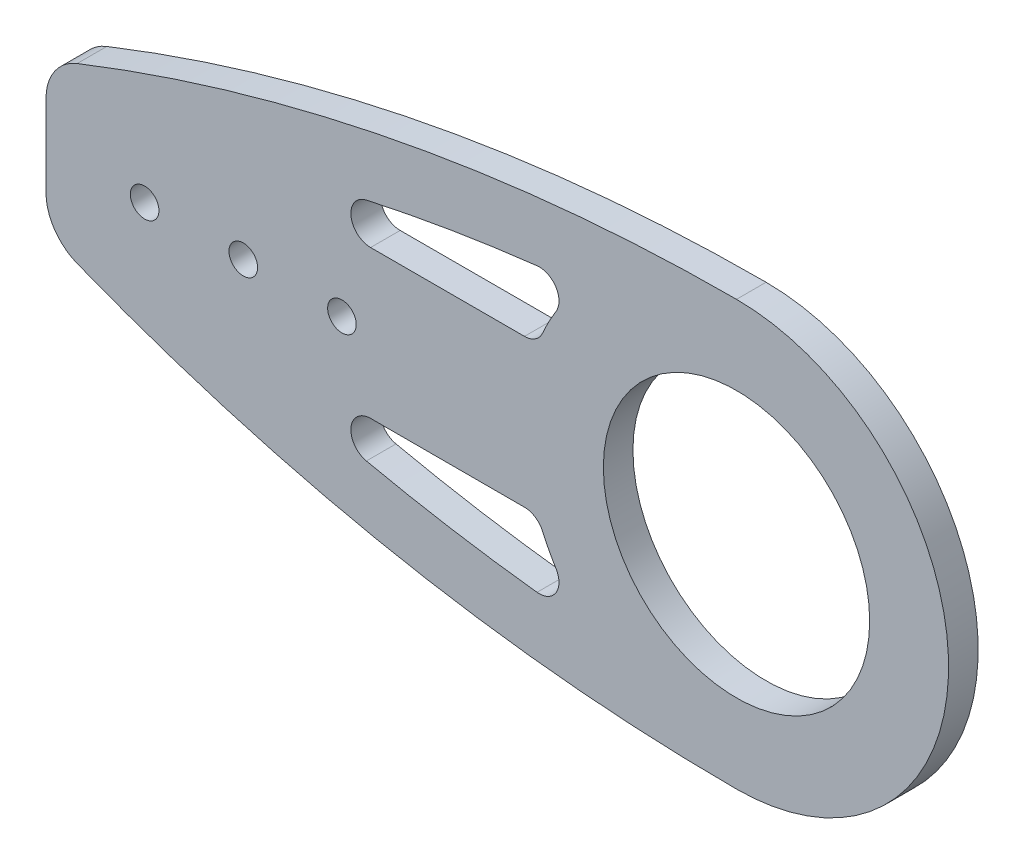
ISO-10303-21;
HEADER;
FILE_DESCRIPTION(('STEP AP214'),'2;1');
FILE_NAME('part.step','',(''),(''),'','','');
FILE_SCHEMA(('AUTOMOTIVE_DESIGN { 1 0 10303 214 1 1 1 1 }'));
ENDSEC;
DATA;
#1=APPLICATION_CONTEXT('core data for automotive mechanical design processes');
#2=APPLICATION_PROTOCOL_DEFINITION('international standard','automotive_design',2000,#1);
#3=PRODUCT_CONTEXT('',#1,'mechanical');
#4=PRODUCT('Part','Part','',(#3));
#5=PRODUCT_RELATED_PRODUCT_CATEGORY('part','',(#4));
#6=PRODUCT_DEFINITION_FORMATION('','',#4);
#7=PRODUCT_DEFINITION_CONTEXT('part definition',#1,'design');
#8=PRODUCT_DEFINITION('design','',#6,#7);
#9=PRODUCT_DEFINITION_SHAPE('','',#8);
#10=(LENGTH_UNIT() NAMED_UNIT(*) SI_UNIT(.MILLI.,.METRE.));
#11=(NAMED_UNIT(*) PLANE_ANGLE_UNIT() SI_UNIT($,.RADIAN.));
#12=(NAMED_UNIT(*) SI_UNIT($,.STERADIAN.) SOLID_ANGLE_UNIT());
#13=UNCERTAINTY_MEASURE_WITH_UNIT(LENGTH_MEASURE(1.E-05),#10,'distance_accuracy_value','');
#14=(GEOMETRIC_REPRESENTATION_CONTEXT(3) GLOBAL_UNCERTAINTY_ASSIGNED_CONTEXT((#13)) GLOBAL_UNIT_ASSIGNED_CONTEXT((#10,
#11,#12)) REPRESENTATION_CONTEXT('',''));
#15=CARTESIAN_POINT('',(0.,0.,0.));
#16=DIRECTION('',(0.,0.,1.));
#17=DIRECTION('',(1.,0.,0.));
#18=AXIS2_PLACEMENT_3D('',#15,#16,#17);
#19=CARTESIAN_POINT('',(20.1494416796099,153.,3.));
#20=DIRECTION('',(0.,0.,1.));
#21=DIRECTION('',(1.,0.,0.));
#22=AXIS2_PLACEMENT_3D('',#19,#20,#21);
#23=PLANE('',#22);
#24=CARTESIAN_POINT('',(20.1494416796099,-7.5,3.));
#25=DIRECTION('',(0.,0.,-1.));
#26=DIRECTION('',(-1.,0.,0.));
#27=AXIS2_PLACEMENT_3D('',#24,#25,#26);
#28=CIRCLE('',#27,21.5);
#29=CARTESIAN_POINT('',(1.85630686055499,-18.796513554716,3.));
#30=VERTEX_POINT('',#29);
#31=CARTESIAN_POINT('',(0.484548781975798,-16.1914893617021,3.));
#32=VERTEX_POINT('',#31);
#33=EDGE_CURVE('E287',#30,#32,#28,.T.);
#34=ORIENTED_EDGE('',*,*,#33,.F.);
#35=CARTESIAN_POINT('',(0.154619900642906,-19.8473520249221,3.));
#36=DIRECTION('',(0.,0.,1.));
#37=DIRECTION('',(1.,0.,0.));
#38=AXIS2_PLACEMENT_3D('',#35,#36,#37);
#39=CIRCLE('',#38,2.);
#40=CARTESIAN_POINT('',(-0.0752056370463723,-21.8341031976224,3.));
#41=VERTEX_POINT('',#40);
#42=EDGE_CURVE('E335',#30,#41,#39,.F.);
#43=ORIENTED_EDGE('',*,*,#42,.T.);
#44=CARTESIAN_POINT('',(20.1494416796099,153.,3.));
#45=DIRECTION('',(0.,0.,1.));
#46=DIRECTION('',(1.,0.,0.));
#47=AXIS2_PLACEMENT_3D('',#44,#45,#46);
#48=CIRCLE('',#47,176.);
#49=CARTESIAN_POINT('',(-17.3714055665337,-18.9540229885058,3.));
#50=VERTEX_POINT('',#49);
#51=EDGE_CURVE('E299',#50,#41,#48,.T.);
#52=ORIENTED_EDGE('',*,*,#51,.F.);
#53=CARTESIAN_POINT('',(-16.9450323023729,-17.,3.));
#54=DIRECTION('',(0.,0.,1.));
#55=DIRECTION('',(1.,0.,0.));
#56=AXIS2_PLACEMENT_3D('',#53,#54,#55);
#57=CIRCLE('',#56,2.);
#58=CARTESIAN_POINT('',(-16.9450323023729,-15.,3.));
#59=VERTEX_POINT('',#58);
#60=EDGE_CURVE('E370',#50,#59,#57,.F.);
#61=ORIENTED_EDGE('',*,*,#60,.T.);
#62=DIRECTION('',(-1.,0.,0.));
#63=VECTOR('',#62,1.);
#64=CARTESIAN_POINT('',(-32.3100665148061,-15.,3.));
#65=LINE('',#64,#63);
#66=CARTESIAN_POINT('',(-1.34474358059481,-15.,3.));
#67=VERTEX_POINT('',#66);
#68=EDGE_CURVE('E294',#67,#59,#65,.T.);
#69=ORIENTED_EDGE('',*,*,#68,.F.);
#70=CARTESIAN_POINT('',(-1.34474358059481,-17.,3.));
#71=DIRECTION('',(0.,0.,1.));
#72=DIRECTION('',(1.,0.,0.));
#73=AXIS2_PLACEMENT_3D('',#70,#71,#72);
#74=CIRCLE('',#73,2.);
#75=EDGE_CURVE('E373',#67,#32,#74,.F.);
#76=ORIENTED_EDGE('',*,*,#75,.T.);
#77=EDGE_LOOP('',(#34,#43,#52,#61,#69,#76));
#78=FACE_BOUND('',#77,.T.);
#79=CARTESIAN_POINT('',(20.1494416796099,-7.5,3.));
#80=DIRECTION('',(0.,0.,-1.));
#81=DIRECTION('',(1.,0.,0.));
#82=AXIS2_PLACEMENT_3D('',#79,#80,#81);
#83=CIRCLE('',#82,21.5);
#84=CARTESIAN_POINT('',(0.484548781975798,1.19148936170213,3.));
#85=VERTEX_POINT('',#84);
#86=CARTESIAN_POINT('',(1.85630686055497,3.79651355471597,3.));
#87=VERTEX_POINT('',#86);
#88=EDGE_CURVE('E279',#85,#87,#83,.T.);
#89=ORIENTED_EDGE('',*,*,#88,.F.);
#90=CARTESIAN_POINT('',(-1.34474358059481,2.00000000000001,3.));
#91=DIRECTION('',(0.,0.,1.));
#92=DIRECTION('',(1.,0.,0.));
#93=AXIS2_PLACEMENT_3D('',#90,#91,#92);
#94=CIRCLE('',#93,2.);
#95=CARTESIAN_POINT('',(-1.34474358059481,0.,3.));
#96=VERTEX_POINT('',#95);
#97=EDGE_CURVE('E361',#85,#96,#94,.F.);
#98=ORIENTED_EDGE('',*,*,#97,.T.);
#99=DIRECTION('',(1.,0.,0.));
#100=VECTOR('',#99,1.);
#101=CARTESIAN_POINT('',(-32.3100665148061,0.,3.));
#102=LINE('',#101,#100);
#103=CARTESIAN_POINT('',(-16.9450323023729,0.,3.));
#104=VERTEX_POINT('',#103);
#105=EDGE_CURVE('E280',#104,#96,#102,.T.);
#106=ORIENTED_EDGE('',*,*,#105,.F.);
#107=CARTESIAN_POINT('',(-16.9450323023729,2.00000000000002,3.));
#108=DIRECTION('',(0.,0.,1.));
#109=DIRECTION('',(1.,0.,0.));
#110=AXIS2_PLACEMENT_3D('',#107,#108,#109);
#111=CIRCLE('',#110,2.);
#112=CARTESIAN_POINT('',(-17.3714055665336,3.95402298850578,3.));
#113=VERTEX_POINT('',#112);
#114=EDGE_CURVE('E54',#104,#113,#111,.F.);
#115=ORIENTED_EDGE('',*,*,#114,.T.);
#116=CARTESIAN_POINT('',(20.1494416796099,-168.,3.));
#117=DIRECTION('',(0.,0.,1.));
#118=DIRECTION('',(1.,0.,0.));
#119=AXIS2_PLACEMENT_3D('',#116,#117,#118);
#120=CIRCLE('',#119,176.);
#121=CARTESIAN_POINT('',(-0.0752056370464174,6.83410319762237,3.));
#122=VERTEX_POINT('',#121);
#123=EDGE_CURVE('E275',#122,#113,#120,.T.);
#124=ORIENTED_EDGE('',*,*,#123,.F.);
#125=CARTESIAN_POINT('',(0.154619900642857,4.84735202492212,3.));
#126=DIRECTION('',(0.,0.,1.));
#127=DIRECTION('',(1.,0.,0.));
#128=AXIS2_PLACEMENT_3D('',#125,#126,#127);
#129=CIRCLE('',#128,2.);
#130=EDGE_CURVE('E334',#122,#87,#129,.F.);
#131=ORIENTED_EDGE('',*,*,#130,.T.);
#132=EDGE_LOOP('',(#89,#98,#106,#115,#124,#131));
#133=FACE_BOUND('',#132,.T.);
#134=CARTESIAN_POINT('',(-39.8505583203901,-7.5,3.));
#135=DIRECTION('',(0.,0.,1.));
#136=DIRECTION('',(1.,0.,0.));
#137=AXIS2_PLACEMENT_3D('',#134,#135,#136);
#138=CIRCLE('',#137,1.45);
#139=CARTESIAN_POINT('',(-38.4005583203901,-7.5,3.));
#140=VERTEX_POINT('',#139);
#141=EDGE_CURVE('E266',#140,#140,#138,.T.);
#142=ORIENTED_EDGE('',*,*,#141,.F.);
#143=EDGE_LOOP('',(#142));
#144=FACE_BOUND('',#143,.T.);
#145=CARTESIAN_POINT('',(-29.8505583203901,-7.5,3.));
#146=DIRECTION('',(0.,0.,1.));
#147=DIRECTION('',(1.,0.,0.));
#148=AXIS2_PLACEMENT_3D('',#145,#146,#147);
#149=CIRCLE('',#148,1.45);
#150=CARTESIAN_POINT('',(-28.4005583203901,-7.5,3.));
#151=VERTEX_POINT('',#150);
#152=EDGE_CURVE('E261',#151,#151,#149,.T.);
#153=ORIENTED_EDGE('',*,*,#152,.F.);
#154=EDGE_LOOP('',(#153));
#155=FACE_BOUND('',#154,.T.);
#156=CARTESIAN_POINT('',(-19.8505583203901,-7.5,3.));
#157=DIRECTION('',(0.,0.,1.));
#158=DIRECTION('',(1.,0.,0.));
#159=AXIS2_PLACEMENT_3D('',#156,#157,#158);
#160=CIRCLE('',#159,1.45);
#161=CARTESIAN_POINT('',(-18.4005583203901,-7.5,3.));
#162=VERTEX_POINT('',#161);
#163=EDGE_CURVE('E252',#162,#162,#160,.T.);
#164=ORIENTED_EDGE('',*,*,#163,.F.);
#165=EDGE_LOOP('',(#164));
#166=FACE_BOUND('',#165,.T.);
#167=DIRECTION('',(0.,-1.,0.));
#168=VECTOR('',#167,1.);
#169=CARTESIAN_POINT('',(-49.8505583203901,0.,3.));
#170=LINE('',#169,#168);
#171=CARTESIAN_POINT('',(-49.8505583203901,-3.36707498194658,3.));
#172=VERTEX_POINT('',#171);
#173=CARTESIAN_POINT('',(-49.8505583203901,-11.6329250180534,3.));
#174=VERTEX_POINT('',#173);
#175=EDGE_CURVE('E205',#172,#174,#170,.T.);
#176=ORIENTED_EDGE('',*,*,#175,.T.);
#177=CARTESIAN_POINT('',(-44.8505583203901,-11.6329250180534,3.));
#178=DIRECTION('',(0.,0.,1.));
#179=DIRECTION('',(1.,0.,0.));
#180=AXIS2_PLACEMENT_3D('',#177,#178,#179);
#181=CIRCLE('',#180,5.);
#182=CARTESIAN_POINT('',(-46.6867165124805,-16.2835726174335,3.));
#183=VERTEX_POINT('',#182);
#184=EDGE_CURVE('E179',#174,#183,#181,.T.);
#185=ORIENTED_EDGE('',*,*,#184,.T.);
#186=CARTESIAN_POINT('',(20.1494416796099,153.,3.));
#187=DIRECTION('',(0.,0.,1.));
#188=DIRECTION('',(1.,0.,0.));
#189=AXIS2_PLACEMENT_3D('',#186,#187,#188);
#190=CIRCLE('',#189,182.);
#191=CARTESIAN_POINT('',(20.1494416796099,-29.,3.));
#192=VERTEX_POINT('',#191);
#193=EDGE_CURVE('E171',#183,#192,#190,.T.);
#194=ORIENTED_EDGE('',*,*,#193,.T.);
#195=CARTESIAN_POINT('',(20.1494416796099,-7.5,3.));
#196=DIRECTION('',(0.,0.,1.));
#197=DIRECTION('',(-1.,0.,0.));
#198=AXIS2_PLACEMENT_3D('',#195,#196,#197);
#199=CIRCLE('',#198,21.5);
#200=CARTESIAN_POINT('',(20.1494416796099,14.,3.));
#201=VERTEX_POINT('',#200);
#202=EDGE_CURVE('E176',#192,#201,#199,.T.);
#203=ORIENTED_EDGE('',*,*,#202,.T.);
#204=CARTESIAN_POINT('',(20.1494416796099,-168.,3.));
#205=DIRECTION('',(0.,0.,1.));
#206=DIRECTION('',(-1.,0.,0.));
#207=AXIS2_PLACEMENT_3D('',#204,#205,#206);
#208=CIRCLE('',#207,182.);
#209=CARTESIAN_POINT('',(-46.6867165124805,1.28357261743348,3.));
#210=VERTEX_POINT('',#209);
#211=EDGE_CURVE('E195',#201,#210,#208,.T.);
#212=ORIENTED_EDGE('',*,*,#211,.T.);
#213=CARTESIAN_POINT('',(-44.8505583203901,-3.36707498194658,3.));
#214=DIRECTION('',(0.,0.,1.));
#215=DIRECTION('',(1.,0.,0.));
#216=AXIS2_PLACEMENT_3D('',#213,#214,#215);
#217=CIRCLE('',#216,5.);
#218=EDGE_CURVE('E217',#210,#172,#217,.T.);
#219=ORIENTED_EDGE('',*,*,#218,.T.);
#220=EDGE_LOOP('',(#176,#185,#194,#203,#212,#219));
#221=FACE_BOUND('',#220,.T.);
#222=CARTESIAN_POINT('',(20.1494416796099,-7.5,3.));
#223=DIRECTION('',(0.,0.,1.));
#224=DIRECTION('',(1.,0.,0.));
#225=AXIS2_PLACEMENT_3D('',#222,#223,#224);
#226=CIRCLE('',#225,13.5);
#227=CARTESIAN_POINT('',(33.6494416796099,-7.5,3.));
#228=VERTEX_POINT('',#227);
#229=EDGE_CURVE('E244',#228,#228,#226,.T.);
#230=ORIENTED_EDGE('',*,*,#229,.F.);
#231=EDGE_LOOP('',(#230));
#232=FACE_BOUND('',#231,.T.);
#233=ADVANCED_FACE('F46',(#78,#133,#144,#155,#166,#221,#232),#23,.T.);
#234=CARTESIAN_POINT('',(20.1494416796099,153.,0.));
#235=DIRECTION('',(0.,0.,1.));
#236=DIRECTION('',(1.,0.,0.));
#237=AXIS2_PLACEMENT_3D('',#234,#235,#236);
#238=PLANE('',#237);
#239=DIRECTION('',(-1.,0.,0.));
#240=VECTOR('',#239,1.);
#241=CARTESIAN_POINT('',(-32.3100665148061,-15.,0.));
#242=LINE('',#241,#240);
#243=CARTESIAN_POINT('',(-1.34474358059481,-15.,0.));
#244=VERTEX_POINT('',#243);
#245=CARTESIAN_POINT('',(-16.9450323023729,-15.,0.));
#246=VERTEX_POINT('',#245);
#247=EDGE_CURVE('E313',#244,#246,#242,.T.);
#248=ORIENTED_EDGE('',*,*,#247,.T.);
#249=CARTESIAN_POINT('',(-16.9450323023729,-17.,0.));
#250=DIRECTION('',(0.,0.,1.));
#251=DIRECTION('',(1.,0.,0.));
#252=AXIS2_PLACEMENT_3D('',#249,#250,#251);
#253=CIRCLE('',#252,2.);
#254=CARTESIAN_POINT('',(-17.3714055665337,-18.9540229885058,0.));
#255=VERTEX_POINT('',#254);
#256=EDGE_CURVE('E326',#246,#255,#253,.T.);
#257=ORIENTED_EDGE('',*,*,#256,.T.);
#258=CARTESIAN_POINT('',(20.1494416796099,153.,0.));
#259=DIRECTION('',(0.,0.,1.));
#260=DIRECTION('',(1.,0.,0.));
#261=AXIS2_PLACEMENT_3D('',#258,#259,#260);
#262=CIRCLE('',#261,176.);
#263=CARTESIAN_POINT('',(-0.0752056370463723,-21.8341031976224,0.));
#264=VERTEX_POINT('',#263);
#265=EDGE_CURVE('E253',#255,#264,#262,.T.);
#266=ORIENTED_EDGE('',*,*,#265,.T.);
#267=CARTESIAN_POINT('',(0.154619900642906,-19.8473520249221,0.));
#268=DIRECTION('',(0.,0.,1.));
#269=DIRECTION('',(1.,0.,0.));
#270=AXIS2_PLACEMENT_3D('',#267,#268,#269);
#271=CIRCLE('',#270,2.);
#272=CARTESIAN_POINT('',(1.85630686055499,-18.796513554716,0.));
#273=VERTEX_POINT('',#272);
#274=EDGE_CURVE('E324',#264,#273,#271,.T.);
#275=ORIENTED_EDGE('',*,*,#274,.T.);
#276=CARTESIAN_POINT('',(20.1494416796099,-7.5,0.));
#277=DIRECTION('',(0.,0.,-1.));
#278=DIRECTION('',(-1.,0.,0.));
#279=AXIS2_PLACEMENT_3D('',#276,#277,#278);
#280=CIRCLE('',#279,21.5);
#281=CARTESIAN_POINT('',(0.484548781975798,-16.1914893617021,0.));
#282=VERTEX_POINT('',#281);
#283=EDGE_CURVE('E305',#273,#282,#280,.T.);
#284=ORIENTED_EDGE('',*,*,#283,.T.);
#285=CARTESIAN_POINT('',(-1.34474358059481,-17.,0.));
#286=DIRECTION('',(0.,0.,1.));
#287=DIRECTION('',(1.,0.,0.));
#288=AXIS2_PLACEMENT_3D('',#285,#286,#287);
#289=CIRCLE('',#288,2.);
#290=EDGE_CURVE('E339',#282,#244,#289,.T.);
#291=ORIENTED_EDGE('',*,*,#290,.T.);
#292=EDGE_LOOP('',(#248,#257,#266,#275,#284,#291));
#293=FACE_BOUND('',#292,.T.);
#294=CARTESIAN_POINT('',(20.1494416796099,-168.,0.));
#295=DIRECTION('',(0.,0.,1.));
#296=DIRECTION('',(1.,0.,0.));
#297=AXIS2_PLACEMENT_3D('',#294,#295,#296);
#298=CIRCLE('',#297,176.);
#299=CARTESIAN_POINT('',(-0.0752056370464174,6.83410319762237,0.));
#300=VERTEX_POINT('',#299);
#301=CARTESIAN_POINT('',(-17.3714055665336,3.95402298850578,0.));
#302=VERTEX_POINT('',#301);
#303=EDGE_CURVE('E478',#300,#302,#298,.T.);
#304=ORIENTED_EDGE('',*,*,#303,.T.);
#305=CARTESIAN_POINT('',(-16.9450323023729,2.00000000000002,0.));
#306=DIRECTION('',(0.,0.,1.));
#307=DIRECTION('',(1.,0.,0.));
#308=AXIS2_PLACEMENT_3D('',#305,#306,#307);
#309=CIRCLE('',#308,2.);
#310=CARTESIAN_POINT('',(-16.9450323023729,0.,0.));
#311=VERTEX_POINT('',#310);
#312=EDGE_CURVE('E12',#302,#311,#309,.T.);
#313=ORIENTED_EDGE('',*,*,#312,.T.);
#314=DIRECTION('',(1.,0.,0.));
#315=VECTOR('',#314,1.);
#316=CARTESIAN_POINT('',(-32.3100665148061,0.,0.));
#317=LINE('',#316,#315);
#318=CARTESIAN_POINT('',(-1.34474358059481,0.,0.));
#319=VERTEX_POINT('',#318);
#320=EDGE_CURVE('E288',#311,#319,#317,.T.);
#321=ORIENTED_EDGE('',*,*,#320,.T.);
#322=CARTESIAN_POINT('',(-1.34474358059481,2.00000000000001,0.));
#323=DIRECTION('',(0.,0.,1.));
#324=DIRECTION('',(1.,0.,0.));
#325=AXIS2_PLACEMENT_3D('',#322,#323,#324);
#326=CIRCLE('',#325,2.);
#327=CARTESIAN_POINT('',(0.484548781975798,1.19148936170213,0.));
#328=VERTEX_POINT('',#327);
#329=EDGE_CURVE('E368',#319,#328,#326,.T.);
#330=ORIENTED_EDGE('',*,*,#329,.T.);
#331=CARTESIAN_POINT('',(20.1494416796099,-7.5,0.));
#332=DIRECTION('',(0.,0.,-1.));
#333=DIRECTION('',(1.,0.,0.));
#334=AXIS2_PLACEMENT_3D('',#331,#332,#333);
#335=CIRCLE('',#334,21.5);
#336=CARTESIAN_POINT('',(1.85630686055497,3.79651355471597,0.));
#337=VERTEX_POINT('',#336);
#338=EDGE_CURVE('E463',#328,#337,#335,.T.);
#339=ORIENTED_EDGE('',*,*,#338,.T.);
#340=CARTESIAN_POINT('',(0.154619900642857,4.84735202492212,0.));
#341=DIRECTION('',(0.,0.,1.));
#342=DIRECTION('',(1.,0.,0.));
#343=AXIS2_PLACEMENT_3D('',#340,#341,#342);
#344=CIRCLE('',#343,2.);
#345=EDGE_CURVE('E68',#337,#300,#344,.T.);
#346=ORIENTED_EDGE('',*,*,#345,.T.);
#347=EDGE_LOOP('',(#304,#313,#321,#330,#339,#346));
#348=FACE_BOUND('',#347,.T.);
#349=CARTESIAN_POINT('',(-39.8505583203901,-7.5,0.));
#350=DIRECTION('',(0.,0.,1.));
#351=DIRECTION('',(1.,0.,0.));
#352=AXIS2_PLACEMENT_3D('',#349,#350,#351);
#353=CIRCLE('',#352,1.45);
#354=CARTESIAN_POINT('',(-38.4005583203901,-7.5,0.));
#355=VERTEX_POINT('',#354);
#356=EDGE_CURVE('E245',#355,#355,#353,.T.);
#357=ORIENTED_EDGE('',*,*,#356,.T.);
#358=EDGE_LOOP('',(#357));
#359=FACE_BOUND('',#358,.T.);
#360=CARTESIAN_POINT('',(-29.8505583203901,-7.5,0.));
#361=DIRECTION('',(0.,0.,1.));
#362=DIRECTION('',(1.,0.,0.));
#363=AXIS2_PLACEMENT_3D('',#360,#361,#362);
#364=CIRCLE('',#363,1.45);
#365=CARTESIAN_POINT('',(-28.4005583203901,-7.5,0.));
#366=VERTEX_POINT('',#365);
#367=EDGE_CURVE('E258',#366,#366,#364,.T.);
#368=ORIENTED_EDGE('',*,*,#367,.T.);
#369=EDGE_LOOP('',(#368));
#370=FACE_BOUND('',#369,.T.);
#371=CARTESIAN_POINT('',(-19.8505583203901,-7.5,0.));
#372=DIRECTION('',(0.,0.,1.));
#373=DIRECTION('',(1.,0.,0.));
#374=AXIS2_PLACEMENT_3D('',#371,#372,#373);
#375=CIRCLE('',#374,1.45);
#376=CARTESIAN_POINT('',(-18.4005583203901,-7.5,0.));
#377=VERTEX_POINT('',#376);
#378=EDGE_CURVE('E250',#377,#377,#375,.T.);
#379=ORIENTED_EDGE('',*,*,#378,.T.);
#380=EDGE_LOOP('',(#379));
#381=FACE_BOUND('',#380,.T.);
#382=CARTESIAN_POINT('',(20.1494416796099,153.,0.));
#383=DIRECTION('',(0.,0.,1.));
#384=DIRECTION('',(1.,0.,0.));
#385=AXIS2_PLACEMENT_3D('',#382,#383,#384);
#386=CIRCLE('',#385,182.);
#387=CARTESIAN_POINT('',(-46.6867165124805,-16.2835726174335,0.));
#388=VERTEX_POINT('',#387);
#389=CARTESIAN_POINT('',(20.1494416796099,-29.,0.));
#390=VERTEX_POINT('',#389);
#391=EDGE_CURVE('E199',#388,#390,#386,.T.);
#392=ORIENTED_EDGE('',*,*,#391,.F.);
#393=CARTESIAN_POINT('',(-44.8505583203901,-11.6329250180534,0.));
#394=DIRECTION('',(0.,0.,1.));
#395=DIRECTION('',(1.,0.,0.));
#396=AXIS2_PLACEMENT_3D('',#393,#394,#395);
#397=CIRCLE('',#396,5.);
#398=CARTESIAN_POINT('',(-49.8505583203901,-11.6329250180534,0.));
#399=VERTEX_POINT('',#398);
#400=EDGE_CURVE('E210',#388,#399,#397,.F.);
#401=ORIENTED_EDGE('',*,*,#400,.T.);
#402=DIRECTION('',(0.,-1.,0.));
#403=VECTOR('',#402,1.);
#404=CARTESIAN_POINT('',(-49.8505583203901,0.,0.));
#405=LINE('',#404,#403);
#406=CARTESIAN_POINT('',(-49.8505583203901,-3.36707498194658,0.));
#407=VERTEX_POINT('',#406);
#408=EDGE_CURVE('E185',#407,#399,#405,.T.);
#409=ORIENTED_EDGE('',*,*,#408,.F.);
#410=CARTESIAN_POINT('',(-44.8505583203901,-3.36707498194658,0.));
#411=DIRECTION('',(0.,0.,1.));
#412=DIRECTION('',(1.,0.,0.));
#413=AXIS2_PLACEMENT_3D('',#410,#411,#412);
#414=CIRCLE('',#413,5.);
#415=CARTESIAN_POINT('',(-46.6867165124805,1.28357261743348,0.));
#416=VERTEX_POINT('',#415);
#417=EDGE_CURVE('E203',#407,#416,#414,.F.);
#418=ORIENTED_EDGE('',*,*,#417,.T.);
#419=CARTESIAN_POINT('',(20.1494416796099,-168.,0.));
#420=DIRECTION('',(0.,0.,1.));
#421=DIRECTION('',(-1.,0.,0.));
#422=AXIS2_PLACEMENT_3D('',#419,#420,#421);
#423=CIRCLE('',#422,182.);
#424=CARTESIAN_POINT('',(20.1494416796099,14.,0.));
#425=VERTEX_POINT('',#424);
#426=EDGE_CURVE('E657',#425,#416,#423,.T.);
#427=ORIENTED_EDGE('',*,*,#426,.F.);
#428=CARTESIAN_POINT('',(20.1494416796099,-7.5,0.));
#429=DIRECTION('',(0.,0.,1.));
#430=DIRECTION('',(-1.,0.,0.));
#431=AXIS2_PLACEMENT_3D('',#428,#429,#430);
#432=CIRCLE('',#431,21.5);
#433=EDGE_CURVE('E656',#390,#425,#432,.T.);
#434=ORIENTED_EDGE('',*,*,#433,.F.);
#435=EDGE_LOOP('',(#392,#401,#409,#418,#427,#434));
#436=FACE_BOUND('',#435,.T.);
#437=CARTESIAN_POINT('',(20.1494416796099,-7.5,0.));
#438=DIRECTION('',(0.,0.,1.));
#439=DIRECTION('',(1.,0.,0.));
#440=AXIS2_PLACEMENT_3D('',#437,#438,#439);
#441=CIRCLE('',#440,13.5);
#442=CARTESIAN_POINT('',(33.6494416796099,-7.5,0.));
#443=VERTEX_POINT('',#442);
#444=EDGE_CURVE('E242',#443,#443,#441,.T.);
#445=ORIENTED_EDGE('',*,*,#444,.T.);
#446=EDGE_LOOP('',(#445));
#447=FACE_BOUND('',#446,.T.);
#448=ADVANCED_FACE('F323',(#293,#348,#359,#370,#381,#436,#447),#238,.F.);
#449=CARTESIAN_POINT('',(20.1494416796099,153.,3.));
#450=DIRECTION('',(0.,0.,-1.));
#451=DIRECTION('',(-1.,0.,0.));
#452=AXIS2_PLACEMENT_3D('',#449,#450,#451);
#453=CYLINDRICAL_SURFACE('',#452,182.);
#454=ORIENTED_EDGE('',*,*,#193,.F.);
#455=DIRECTION('',(0.,0.,-1.));
#456=VECTOR('',#455,1.);
#457=CARTESIAN_POINT('',(-46.6867165124805,-16.2835726174335,3.));
#458=LINE('',#457,#456);
#459=EDGE_CURVE('E201',#183,#388,#458,.T.);
#460=ORIENTED_EDGE('',*,*,#459,.T.);
#461=ORIENTED_EDGE('',*,*,#391,.T.);
#462=DIRECTION('',(0.,0.,-1.));
#463=VECTOR('',#462,1.);
#464=CARTESIAN_POINT('',(20.1494416796099,-29.,3.));
#465=LINE('',#464,#463);
#466=EDGE_CURVE('E190',#192,#390,#465,.T.);
#467=ORIENTED_EDGE('',*,*,#466,.F.);
#468=EDGE_LOOP('',(#454,#460,#461,#467));
#469=FACE_BOUND('',#468,.T.);
#470=ADVANCED_FACE('F197',(#469),#453,.T.);
#471=CARTESIAN_POINT('',(20.1494416796099,-7.5,3.));
#472=DIRECTION('',(0.,0.,-1.));
#473=DIRECTION('',(-1.,0.,0.));
#474=AXIS2_PLACEMENT_3D('',#471,#472,#473);
#475=CYLINDRICAL_SURFACE('',#474,21.5);
#476=ORIENTED_EDGE('',*,*,#433,.T.);
#477=DIRECTION('',(0.,0.,-1.));
#478=VECTOR('',#477,1.);
#479=CARTESIAN_POINT('',(20.1494416796099,14.,3.));
#480=LINE('',#479,#478);
#481=EDGE_CURVE('E192',#201,#425,#480,.T.);
#482=ORIENTED_EDGE('',*,*,#481,.F.);
#483=ORIENTED_EDGE('',*,*,#202,.F.);
#484=ORIENTED_EDGE('',*,*,#466,.T.);
#485=EDGE_LOOP('',(#476,#482,#483,#484));
#486=FACE_BOUND('',#485,.T.);
#487=ADVANCED_FACE('F189',(#486),#475,.T.);
#488=CARTESIAN_POINT('',(20.1494416796099,-168.,3.));
#489=DIRECTION('',(0.,0.,-1.));
#490=DIRECTION('',(-1.,0.,0.));
#491=AXIS2_PLACEMENT_3D('',#488,#489,#490);
#492=CYLINDRICAL_SURFACE('',#491,182.);
#493=ORIENTED_EDGE('',*,*,#426,.T.);
#494=DIRECTION('',(0.,0.,-1.));
#495=VECTOR('',#494,1.);
#496=CARTESIAN_POINT('',(-46.6867165124805,1.2835726174335,3.));
#497=LINE('',#496,#495);
#498=EDGE_CURVE('E469',#416,#210,#497,.F.);
#499=ORIENTED_EDGE('',*,*,#498,.T.);
#500=ORIENTED_EDGE('',*,*,#211,.F.);
#501=ORIENTED_EDGE('',*,*,#481,.T.);
#502=EDGE_LOOP('',(#493,#499,#500,#501));
#503=FACE_BOUND('',#502,.T.);
#504=ADVANCED_FACE('F424',(#503),#492,.T.);
#505=CARTESIAN_POINT('',(-49.8505583203901,0.,3.));
#506=DIRECTION('',(1.,0.,0.));
#507=DIRECTION('',(0.,0.,-1.));
#508=AXIS2_PLACEMENT_3D('',#505,#506,#507);
#509=PLANE('',#508);
#510=ORIENTED_EDGE('',*,*,#408,.T.);
#511=DIRECTION('',(0.,0.,-1.));
#512=VECTOR('',#511,1.);
#513=CARTESIAN_POINT('',(-49.8505583203901,-11.6329250180534,3.));
#514=LINE('',#513,#512);
#515=EDGE_CURVE('E215',#399,#174,#514,.F.);
#516=ORIENTED_EDGE('',*,*,#515,.T.);
#517=ORIENTED_EDGE('',*,*,#175,.F.);
#518=DIRECTION('',(0.,0.,-1.));
#519=VECTOR('',#518,1.);
#520=CARTESIAN_POINT('',(-49.8505583203901,-3.36707498194658,3.));
#521=LINE('',#520,#519);
#522=EDGE_CURVE('E212',#172,#407,#521,.T.);
#523=ORIENTED_EDGE('',*,*,#522,.T.);
#524=EDGE_LOOP('',(#510,#516,#517,#523));
#525=FACE_BOUND('',#524,.T.);
#526=ADVANCED_FACE('F421',(#525),#509,.F.);
#527=CARTESIAN_POINT('',(20.1494416796099,-7.5,3.));
#528=DIRECTION('',(0.,0.,-1.));
#529=DIRECTION('',(-1.,0.,0.));
#530=AXIS2_PLACEMENT_3D('',#527,#528,#529);
#531=CYLINDRICAL_SURFACE('',#530,13.5);
#532=ORIENTED_EDGE('',*,*,#229,.T.);
#533=EDGE_LOOP('',(#532));
#534=FACE_BOUND('',#533,.T.);
#535=ORIENTED_EDGE('',*,*,#444,.F.);
#536=EDGE_LOOP('',(#535));
#537=FACE_BOUND('',#536,.T.);
#538=ADVANCED_FACE('F418',(#534,#537),#531,.F.);
#539=CARTESIAN_POINT('',(-19.8505583203901,-7.5,0.));
#540=DIRECTION('',(0.,0.,1.));
#541=DIRECTION('',(1.,0.,0.));
#542=AXIS2_PLACEMENT_3D('',#539,#540,#541);
#543=CYLINDRICAL_SURFACE('',#542,1.45);
#544=ORIENTED_EDGE('',*,*,#378,.F.);
#545=EDGE_LOOP('',(#544));
#546=FACE_BOUND('',#545,.T.);
#547=ORIENTED_EDGE('',*,*,#163,.T.);
#548=EDGE_LOOP('',(#547));
#549=FACE_BOUND('',#548,.T.);
#550=ADVANCED_FACE('F491',(#546,#549),#543,.F.);
#551=CARTESIAN_POINT('',(-29.8505583203901,-7.5,0.));
#552=DIRECTION('',(0.,0.,1.));
#553=DIRECTION('',(1.,0.,0.));
#554=AXIS2_PLACEMENT_3D('',#551,#552,#553);
#555=CYLINDRICAL_SURFACE('',#554,1.45);
#556=ORIENTED_EDGE('',*,*,#367,.F.);
#557=EDGE_LOOP('',(#556));
#558=FACE_BOUND('',#557,.T.);
#559=ORIENTED_EDGE('',*,*,#152,.T.);
#560=EDGE_LOOP('',(#559));
#561=FACE_BOUND('',#560,.T.);
#562=ADVANCED_FACE('F493',(#558,#561),#555,.F.);
#563=CARTESIAN_POINT('',(-39.8505583203901,-7.5,0.));
#564=DIRECTION('',(0.,0.,1.));
#565=DIRECTION('',(1.,0.,0.));
#566=AXIS2_PLACEMENT_3D('',#563,#564,#565);
#567=CYLINDRICAL_SURFACE('',#566,1.45);
#568=ORIENTED_EDGE('',*,*,#356,.F.);
#569=EDGE_LOOP('',(#568));
#570=FACE_BOUND('',#569,.T.);
#571=ORIENTED_EDGE('',*,*,#141,.T.);
#572=EDGE_LOOP('',(#571));
#573=FACE_BOUND('',#572,.T.);
#574=ADVANCED_FACE('F437',(#570,#573),#567,.F.);
#575=CARTESIAN_POINT('',(-44.8505583203901,-11.6329250180534,3.));
#576=DIRECTION('',(0.,0.,-1.));
#577=DIRECTION('',(-1.,0.,0.));
#578=AXIS2_PLACEMENT_3D('',#575,#576,#577);
#579=CYLINDRICAL_SURFACE('',#578,5.);
#580=ORIENTED_EDGE('',*,*,#184,.F.);
#581=ORIENTED_EDGE('',*,*,#515,.F.);
#582=ORIENTED_EDGE('',*,*,#400,.F.);
#583=ORIENTED_EDGE('',*,*,#459,.F.);
#584=EDGE_LOOP('',(#580,#581,#582,#583));
#585=FACE_BOUND('',#584,.T.);
#586=ADVANCED_FACE('F433',(#585),#579,.T.);
#587=CARTESIAN_POINT('',(-44.8505583203901,-3.36707498194658,3.));
#588=DIRECTION('',(0.,0.,-1.));
#589=DIRECTION('',(-1.,0.,0.));
#590=AXIS2_PLACEMENT_3D('',#587,#588,#589);
#591=CYLINDRICAL_SURFACE('',#590,5.);
#592=ORIENTED_EDGE('',*,*,#218,.F.);
#593=ORIENTED_EDGE('',*,*,#498,.F.);
#594=ORIENTED_EDGE('',*,*,#417,.F.);
#595=ORIENTED_EDGE('',*,*,#522,.F.);
#596=EDGE_LOOP('',(#592,#593,#594,#595));
#597=FACE_BOUND('',#596,.T.);
#598=ADVANCED_FACE('F436',(#597),#591,.T.);
#599=CARTESIAN_POINT('',(20.1494416796099,-7.5,0.));
#600=DIRECTION('',(0.,0.,1.));
#601=DIRECTION('',(1.,0.,0.));
#602=AXIS2_PLACEMENT_3D('',#599,#600,#601);
#603=CYLINDRICAL_SURFACE('',#602,21.5);
#604=ORIENTED_EDGE('',*,*,#338,.F.);
#605=DIRECTION('',(0.,0.,1.));
#606=VECTOR('',#605,1.);
#607=CARTESIAN_POINT('',(0.484548781975798,1.19148936170214,0.));
#608=LINE('',#607,#606);
#609=EDGE_CURVE('E462',#328,#85,#608,.T.);
#610=ORIENTED_EDGE('',*,*,#609,.T.);
#611=ORIENTED_EDGE('',*,*,#88,.T.);
#612=DIRECTION('',(0.,0.,1.));
#613=VECTOR('',#612,1.);
#614=CARTESIAN_POINT('',(1.85630686055497,3.79651355471597,0.));
#615=LINE('',#614,#613);
#616=EDGE_CURVE('E457',#87,#337,#615,.F.);
#617=ORIENTED_EDGE('',*,*,#616,.T.);
#618=EDGE_LOOP('',(#604,#610,#611,#617));
#619=FACE_BOUND('',#618,.T.);
#620=ADVANCED_FACE('F440',(#619),#603,.T.);
#621=CARTESIAN_POINT('',(-32.3100665148061,0.,0.));
#622=DIRECTION('',(0.,-1.,0.));
#623=DIRECTION('',(1.,0.,0.));
#624=AXIS2_PLACEMENT_3D('',#621,#622,#623);
#625=PLANE('',#624);
#626=ORIENTED_EDGE('',*,*,#105,.T.);
#627=DIRECTION('',(0.,0.,-1.));
#628=VECTOR('',#627,1.);
#629=CARTESIAN_POINT('',(-1.34474358059481,0.,0.));
#630=LINE('',#629,#628);
#631=EDGE_CURVE('E467',#96,#319,#630,.T.);
#632=ORIENTED_EDGE('',*,*,#631,.T.);
#633=ORIENTED_EDGE('',*,*,#320,.F.);
#634=DIRECTION('',(0.,0.,-1.));
#635=VECTOR('',#634,1.);
#636=CARTESIAN_POINT('',(-16.9450323023729,0.,3.));
#637=LINE('',#636,#635);
#638=EDGE_CURVE('E465',#311,#104,#637,.F.);
#639=ORIENTED_EDGE('',*,*,#638,.T.);
#640=EDGE_LOOP('',(#626,#632,#633,#639));
#641=FACE_BOUND('',#640,.T.);
#642=ADVANCED_FACE('F476',(#641),#625,.F.);
#643=CARTESIAN_POINT('',(20.1494416796099,-168.,0.));
#644=DIRECTION('',(0.,0.,1.));
#645=DIRECTION('',(1.,0.,0.));
#646=AXIS2_PLACEMENT_3D('',#643,#644,#645);
#647=CYLINDRICAL_SURFACE('',#646,176.);
#648=ORIENTED_EDGE('',*,*,#303,.F.);
#649=DIRECTION('',(0.,0.,1.));
#650=VECTOR('',#649,1.);
#651=CARTESIAN_POINT('',(-0.0752056370464209,6.83410319762237,0.));
#652=LINE('',#651,#650);
#653=EDGE_CURVE('E357',#300,#122,#652,.T.);
#654=ORIENTED_EDGE('',*,*,#653,.T.);
#655=ORIENTED_EDGE('',*,*,#123,.T.);
#656=DIRECTION('',(0.,0.,1.));
#657=VECTOR('',#656,1.);
#658=CARTESIAN_POINT('',(-17.3714055665336,3.95402298850575,0.));
#659=LINE('',#658,#657);
#660=EDGE_CURVE('E61',#113,#302,#659,.F.);
#661=ORIENTED_EDGE('',*,*,#660,.T.);
#662=EDGE_LOOP('',(#648,#654,#655,#661));
#663=FACE_BOUND('',#662,.T.);
#664=ADVANCED_FACE('F355',(#663),#647,.F.);
#665=CARTESIAN_POINT('',(20.1494416796099,-7.5,0.));
#666=DIRECTION('',(0.,0.,1.));
#667=DIRECTION('',(1.,0.,0.));
#668=AXIS2_PLACEMENT_3D('',#665,#666,#667);
#669=CYLINDRICAL_SURFACE('',#668,21.5);
#670=ORIENTED_EDGE('',*,*,#33,.T.);
#671=DIRECTION('',(0.,0.,1.));
#672=VECTOR('',#671,1.);
#673=CARTESIAN_POINT('',(0.484548781975798,-16.1914893617021,0.));
#674=LINE('',#673,#672);
#675=EDGE_CURVE('E359',#32,#282,#674,.F.);
#676=ORIENTED_EDGE('',*,*,#675,.T.);
#677=ORIENTED_EDGE('',*,*,#283,.F.);
#678=DIRECTION('',(0.,0.,1.));
#679=VECTOR('',#678,1.);
#680=CARTESIAN_POINT('',(1.85630686055498,-18.796513554716,0.));
#681=LINE('',#680,#679);
#682=EDGE_CURVE('E333',#273,#30,#681,.T.);
#683=ORIENTED_EDGE('',*,*,#682,.T.);
#684=EDGE_LOOP('',(#670,#676,#677,#683));
#685=FACE_BOUND('',#684,.T.);
#686=ADVANCED_FACE('F395',(#685),#669,.T.);
#687=CARTESIAN_POINT('',(20.1494416796099,153.,0.));
#688=DIRECTION('',(0.,0.,1.));
#689=DIRECTION('',(1.,0.,0.));
#690=AXIS2_PLACEMENT_3D('',#687,#688,#689);
#691=CYLINDRICAL_SURFACE('',#690,176.);
#692=ORIENTED_EDGE('',*,*,#265,.F.);
#693=DIRECTION('',(0.,0.,1.));
#694=VECTOR('',#693,1.);
#695=CARTESIAN_POINT('',(-17.3714055665337,-18.9540229885058,0.));
#696=LINE('',#695,#694);
#697=EDGE_CURVE('E387',#255,#50,#696,.T.);
#698=ORIENTED_EDGE('',*,*,#697,.T.);
#699=ORIENTED_EDGE('',*,*,#51,.T.);
#700=DIRECTION('',(0.,0.,1.));
#701=VECTOR('',#700,1.);
#702=CARTESIAN_POINT('',(-0.0752056370463723,-21.8341031976224,0.));
#703=LINE('',#702,#701);
#704=EDGE_CURVE('E331',#41,#264,#703,.F.);
#705=ORIENTED_EDGE('',*,*,#704,.T.);
#706=EDGE_LOOP('',(#692,#698,#699,#705));
#707=FACE_BOUND('',#706,.T.);
#708=ADVANCED_FACE('F400',(#707),#691,.F.);
#709=CARTESIAN_POINT('',(-32.3100665148061,-15.,0.));
#710=DIRECTION('',(0.,1.,0.));
#711=DIRECTION('',(-1.,0.,0.));
#712=AXIS2_PLACEMENT_3D('',#709,#710,#711);
#713=PLANE('',#712);
#714=ORIENTED_EDGE('',*,*,#68,.T.);
#715=DIRECTION('',(0.,0.,-1.));
#716=VECTOR('',#715,1.);
#717=CARTESIAN_POINT('',(-16.9450323023729,-15.,0.));
#718=LINE('',#717,#716);
#719=EDGE_CURVE('E385',#59,#246,#718,.T.);
#720=ORIENTED_EDGE('',*,*,#719,.T.);
#721=ORIENTED_EDGE('',*,*,#247,.F.);
#722=DIRECTION('',(0.,0.,-1.));
#723=VECTOR('',#722,1.);
#724=CARTESIAN_POINT('',(-1.34474358059481,-15.,3.));
#725=LINE('',#724,#723);
#726=EDGE_CURVE('E382',#244,#67,#725,.F.);
#727=ORIENTED_EDGE('',*,*,#726,.T.);
#728=EDGE_LOOP('',(#714,#720,#721,#727));
#729=FACE_BOUND('',#728,.T.);
#730=ADVANCED_FACE('F381',(#729),#713,.F.);
#731=CARTESIAN_POINT('',(-1.34474358059481,2.00000000000001,0.));
#732=DIRECTION('',(0.,0.,1.));
#733=DIRECTION('',(1.,0.,0.));
#734=AXIS2_PLACEMENT_3D('',#731,#732,#733);
#735=CYLINDRICAL_SURFACE('',#734,2.);
#736=ORIENTED_EDGE('',*,*,#329,.F.);
#737=ORIENTED_EDGE('',*,*,#631,.F.);
#738=ORIENTED_EDGE('',*,*,#97,.F.);
#739=ORIENTED_EDGE('',*,*,#609,.F.);
#740=EDGE_LOOP('',(#736,#737,#738,#739));
#741=FACE_BOUND('',#740,.T.);
#742=ADVANCED_FACE('F407',(#741),#735,.F.);
#743=CARTESIAN_POINT('',(-16.9450323023729,-17.,0.));
#744=DIRECTION('',(0.,0.,1.));
#745=DIRECTION('',(1.,0.,0.));
#746=AXIS2_PLACEMENT_3D('',#743,#744,#745);
#747=CYLINDRICAL_SURFACE('',#746,2.);
#748=ORIENTED_EDGE('',*,*,#256,.F.);
#749=ORIENTED_EDGE('',*,*,#719,.F.);
#750=ORIENTED_EDGE('',*,*,#60,.F.);
#751=ORIENTED_EDGE('',*,*,#697,.F.);
#752=EDGE_LOOP('',(#748,#749,#750,#751));
#753=FACE_BOUND('',#752,.T.);
#754=ADVANCED_FACE('F399',(#753),#747,.F.);
#755=CARTESIAN_POINT('',(-1.34474358059481,-17.,0.));
#756=DIRECTION('',(0.,0.,1.));
#757=DIRECTION('',(1.,0.,0.));
#758=AXIS2_PLACEMENT_3D('',#755,#756,#757);
#759=CYLINDRICAL_SURFACE('',#758,2.);
#760=ORIENTED_EDGE('',*,*,#290,.F.);
#761=ORIENTED_EDGE('',*,*,#675,.F.);
#762=ORIENTED_EDGE('',*,*,#75,.F.);
#763=ORIENTED_EDGE('',*,*,#726,.F.);
#764=EDGE_LOOP('',(#760,#761,#762,#763));
#765=FACE_BOUND('',#764,.T.);
#766=ADVANCED_FACE('F386',(#765),#759,.F.);
#767=CARTESIAN_POINT('',(0.154619900642906,-19.8473520249221,0.));
#768=DIRECTION('',(0.,0.,1.));
#769=DIRECTION('',(1.,0.,0.));
#770=AXIS2_PLACEMENT_3D('',#767,#768,#769);
#771=CYLINDRICAL_SURFACE('',#770,2.);
#772=ORIENTED_EDGE('',*,*,#274,.F.);
#773=ORIENTED_EDGE('',*,*,#704,.F.);
#774=ORIENTED_EDGE('',*,*,#42,.F.);
#775=ORIENTED_EDGE('',*,*,#682,.F.);
#776=EDGE_LOOP('',(#772,#773,#774,#775));
#777=FACE_BOUND('',#776,.T.);
#778=ADVANCED_FACE('F330',(#777),#771,.F.);
#779=CARTESIAN_POINT('',(0.154619900642857,4.84735202492212,0.));
#780=DIRECTION('',(0.,0.,1.));
#781=DIRECTION('',(1.,0.,0.));
#782=AXIS2_PLACEMENT_3D('',#779,#780,#781);
#783=CYLINDRICAL_SURFACE('',#782,2.);
#784=ORIENTED_EDGE('',*,*,#345,.F.);
#785=ORIENTED_EDGE('',*,*,#616,.F.);
#786=ORIENTED_EDGE('',*,*,#130,.F.);
#787=ORIENTED_EDGE('',*,*,#653,.F.);
#788=EDGE_LOOP('',(#784,#785,#786,#787));
#789=FACE_BOUND('',#788,.T.);
#790=ADVANCED_FACE('F450',(#789),#783,.F.);
#791=CARTESIAN_POINT('',(-16.9450323023729,2.00000000000002,0.));
#792=DIRECTION('',(0.,0.,1.));
#793=DIRECTION('',(1.,0.,0.));
#794=AXIS2_PLACEMENT_3D('',#791,#792,#793);
#795=CYLINDRICAL_SURFACE('',#794,2.);
#796=ORIENTED_EDGE('',*,*,#312,.F.);
#797=ORIENTED_EDGE('',*,*,#660,.F.);
#798=ORIENTED_EDGE('',*,*,#114,.F.);
#799=ORIENTED_EDGE('',*,*,#638,.F.);
#800=EDGE_LOOP('',(#796,#797,#798,#799));
#801=FACE_BOUND('',#800,.T.);
#802=ADVANCED_FACE('F48',(#801),#795,.F.);
#803=CLOSED_SHELL('',(#233,#448,#470,#487,#504,#526,#538,#550,#562,#574,#586,#598,#620,#642,
#664,#686,#708,#730,#742,#754,#766,#778,#790,#802));
#804=MANIFOLD_SOLID_BREP('B2',#803);
#805=ADVANCED_BREP_SHAPE_REPRESENTATION('',(#18,#804),#14);
#806=SHAPE_DEFINITION_REPRESENTATION(#9,#805);
ENDSEC;
END-ISO-10303-21;
